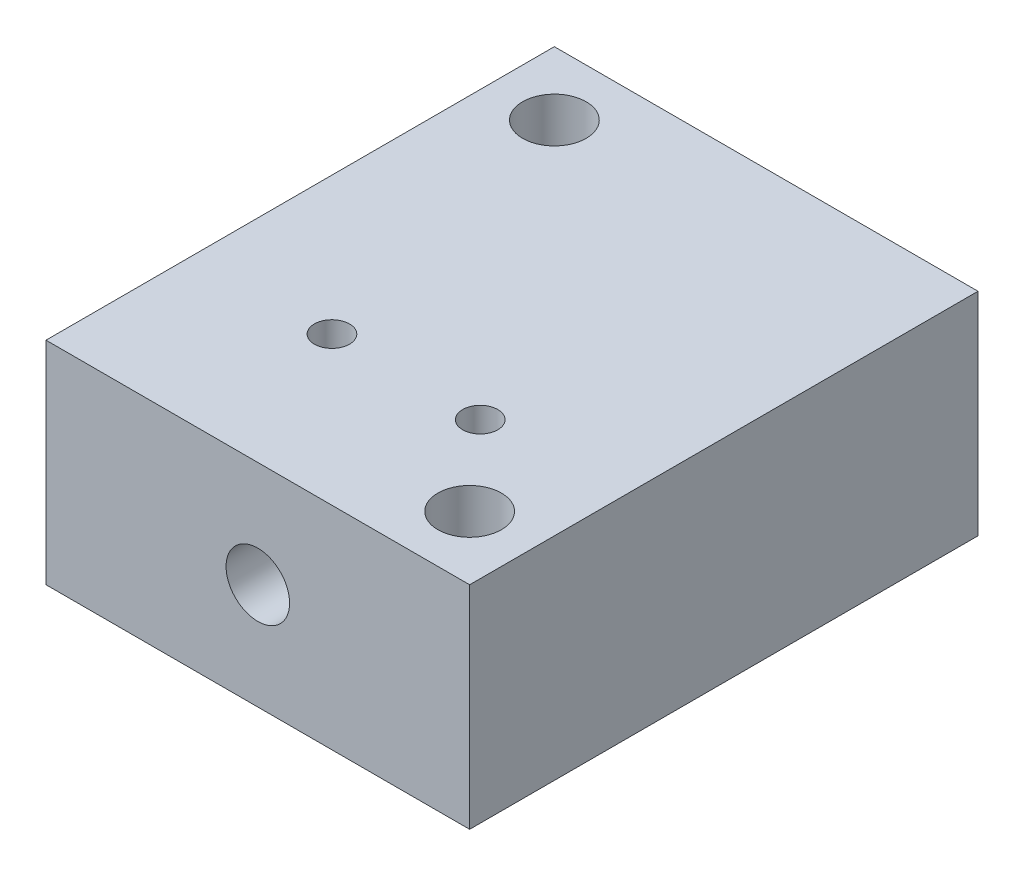
ISO-10303-21;
HEADER;
FILE_DESCRIPTION(('STEP AP214'),'2;1');
FILE_NAME('part.step','',(''),(''),'','','');
FILE_SCHEMA(('AUTOMOTIVE_DESIGN { 1 0 10303 214 1 1 1 1 }'));
ENDSEC;
DATA;
#1=APPLICATION_CONTEXT('core data for automotive mechanical design processes');
#2=APPLICATION_PROTOCOL_DEFINITION('international standard','automotive_design',2000,#1);
#3=PRODUCT_CONTEXT('',#1,'mechanical');
#4=PRODUCT('Part','Part','',(#3));
#5=PRODUCT_RELATED_PRODUCT_CATEGORY('part','',(#4));
#6=PRODUCT_DEFINITION_FORMATION('','',#4);
#7=PRODUCT_DEFINITION_CONTEXT('part definition',#1,'design');
#8=PRODUCT_DEFINITION('design','',#6,#7);
#9=PRODUCT_DEFINITION_SHAPE('','',#8);
#10=(LENGTH_UNIT() NAMED_UNIT(*) SI_UNIT(.MILLI.,.METRE.));
#11=(NAMED_UNIT(*) PLANE_ANGLE_UNIT() SI_UNIT($,.RADIAN.));
#12=(NAMED_UNIT(*) SI_UNIT($,.STERADIAN.) SOLID_ANGLE_UNIT());
#13=UNCERTAINTY_MEASURE_WITH_UNIT(LENGTH_MEASURE(1.E-05),#10,'distance_accuracy_value','');
#14=(GEOMETRIC_REPRESENTATION_CONTEXT(3) GLOBAL_UNCERTAINTY_ASSIGNED_CONTEXT((#13)) GLOBAL_UNIT_ASSIGNED_CONTEXT((#10,
#11,#12)) REPRESENTATION_CONTEXT('',''));
#15=CARTESIAN_POINT('',(0.,0.,0.));
#16=DIRECTION('',(0.,0.,1.));
#17=DIRECTION('',(1.,0.,0.));
#18=AXIS2_PLACEMENT_3D('',#15,#16,#17);
#19=CARTESIAN_POINT('',(-50.,-25.,120.));
#20=DIRECTION('',(1.,0.,0.));
#21=DIRECTION('',(0.,1.,0.));
#22=AXIS2_PLACEMENT_3D('',#19,#20,#21);
#23=PLANE('',#22);
#24=DIRECTION('',(0.,-1.,0.));
#25=VECTOR('',#24,1.);
#26=CARTESIAN_POINT('',(-50.,-25.,0.));
#27=LINE('',#26,#25);
#28=CARTESIAN_POINT('',(-50.,25.,0.));
#29=VERTEX_POINT('',#28);
#30=CARTESIAN_POINT('',(-50.,-25.,0.));
#31=VERTEX_POINT('',#30);
#32=EDGE_CURVE('E155',#29,#31,#27,.T.);
#33=ORIENTED_EDGE('',*,*,#32,.T.);
#34=DIRECTION('',(0.,0.,-1.));
#35=VECTOR('',#34,1.);
#36=CARTESIAN_POINT('',(-50.,-25.,120.));
#37=LINE('',#36,#35);
#38=CARTESIAN_POINT('',(-50.,-25.,120.));
#39=VERTEX_POINT('',#38);
#40=EDGE_CURVE('E13',#39,#31,#37,.T.);
#41=ORIENTED_EDGE('',*,*,#40,.F.);
#42=DIRECTION('',(0.,-1.,0.));
#43=VECTOR('',#42,1.);
#44=CARTESIAN_POINT('',(-50.,-25.,120.));
#45=LINE('',#44,#43);
#46=CARTESIAN_POINT('',(-50.,25.,120.));
#47=VERTEX_POINT('',#46);
#48=EDGE_CURVE('E156',#47,#39,#45,.T.);
#49=ORIENTED_EDGE('',*,*,#48,.F.);
#50=DIRECTION('',(0.,0.,-1.));
#51=VECTOR('',#50,1.);
#52=CARTESIAN_POINT('',(-50.,25.,120.));
#53=LINE('',#52,#51);
#54=EDGE_CURVE('E162',#47,#29,#53,.T.);
#55=ORIENTED_EDGE('',*,*,#54,.T.);
#56=EDGE_LOOP('',(#33,#41,#49,#55));
#57=FACE_BOUND('',#56,.T.);
#58=ADVANCED_FACE('F44',(#57),#23,.F.);
#59=CARTESIAN_POINT('',(50.,-25.,120.));
#60=DIRECTION('',(0.,1.,0.));
#61=DIRECTION('',(-1.,0.,0.));
#62=AXIS2_PLACEMENT_3D('',#59,#60,#61);
#63=PLANE('',#62);
#64=CARTESIAN_POINT('',(35.,-25.,105.));
#65=DIRECTION('',(0.,1.,0.));
#66=DIRECTION('',(0.,0.,1.));
#67=AXIS2_PLACEMENT_3D('',#64,#65,#66);
#68=CIRCLE('',#67,4.49999999999999);
#69=CARTESIAN_POINT('',(35.,-25.,109.5));
#70=VERTEX_POINT('',#69);
#71=EDGE_CURVE('E140',#70,#70,#68,.T.);
#72=ORIENTED_EDGE('',*,*,#71,.T.);
#73=EDGE_LOOP('',(#72));
#74=FACE_BOUND('',#73,.T.);
#75=CARTESIAN_POINT('',(-35.,-25.,15.));
#76=DIRECTION('',(0.,1.,0.));
#77=DIRECTION('',(0.,0.,1.));
#78=AXIS2_PLACEMENT_3D('',#75,#76,#77);
#79=CIRCLE('',#78,4.49999999999999);
#80=CARTESIAN_POINT('',(-35.,-25.,19.5));
#81=VERTEX_POINT('',#80);
#82=EDGE_CURVE('E152',#81,#81,#79,.T.);
#83=ORIENTED_EDGE('',*,*,#82,.T.);
#84=EDGE_LOOP('',(#83));
#85=FACE_BOUND('',#84,.T.);
#86=DIRECTION('',(1.,0.,0.));
#87=VECTOR('',#86,1.);
#88=CARTESIAN_POINT('',(50.,-25.,0.));
#89=LINE('',#88,#87);
#90=CARTESIAN_POINT('',(50.,-25.,0.));
#91=VERTEX_POINT('',#90);
#92=EDGE_CURVE('E165',#31,#91,#89,.T.);
#93=ORIENTED_EDGE('',*,*,#92,.T.);
#94=DIRECTION('',(0.,0.,-1.));
#95=VECTOR('',#94,1.);
#96=CARTESIAN_POINT('',(50.,-25.,120.));
#97=LINE('',#96,#95);
#98=CARTESIAN_POINT('',(50.,-25.,120.));
#99=VERTEX_POINT('',#98);
#100=EDGE_CURVE('E52',#99,#91,#97,.T.);
#101=ORIENTED_EDGE('',*,*,#100,.F.);
#102=DIRECTION('',(1.,0.,0.));
#103=VECTOR('',#102,1.);
#104=CARTESIAN_POINT('',(50.,-25.,120.));
#105=LINE('',#104,#103);
#106=EDGE_CURVE('E91',#39,#99,#105,.T.);
#107=ORIENTED_EDGE('',*,*,#106,.F.);
#108=ORIENTED_EDGE('',*,*,#40,.T.);
#109=EDGE_LOOP('',(#93,#101,#107,#108));
#110=FACE_BOUND('',#109,.T.);
#111=ADVANCED_FACE('F192',(#74,#85,#110),#63,.F.);
#112=CARTESIAN_POINT('',(50.,-25.,120.));
#113=DIRECTION('',(-1.,0.,0.));
#114=DIRECTION('',(0.,-1.,0.));
#115=AXIS2_PLACEMENT_3D('',#112,#113,#114);
#116=PLANE('',#115);
#117=DIRECTION('',(0.,1.,0.));
#118=VECTOR('',#117,1.);
#119=CARTESIAN_POINT('',(50.,-25.,0.));
#120=LINE('',#119,#118);
#121=CARTESIAN_POINT('',(50.,25.,0.));
#122=VERTEX_POINT('',#121);
#123=EDGE_CURVE('E78',#91,#122,#120,.T.);
#124=ORIENTED_EDGE('',*,*,#123,.T.);
#125=DIRECTION('',(0.,0.,-1.));
#126=VECTOR('',#125,1.);
#127=CARTESIAN_POINT('',(50.,25.,120.));
#128=LINE('',#127,#126);
#129=CARTESIAN_POINT('',(50.,25.,120.));
#130=VERTEX_POINT('',#129);
#131=EDGE_CURVE('E170',#130,#122,#128,.T.);
#132=ORIENTED_EDGE('',*,*,#131,.F.);
#133=DIRECTION('',(0.,1.,0.));
#134=VECTOR('',#133,1.);
#135=CARTESIAN_POINT('',(50.,-25.,120.));
#136=LINE('',#135,#134);
#137=EDGE_CURVE('E159',#99,#130,#136,.T.);
#138=ORIENTED_EDGE('',*,*,#137,.F.);
#139=ORIENTED_EDGE('',*,*,#100,.T.);
#140=EDGE_LOOP('',(#124,#132,#138,#139));
#141=FACE_BOUND('',#140,.T.);
#142=ADVANCED_FACE('F172',(#141),#116,.F.);
#143=CARTESIAN_POINT('',(50.,25.,120.));
#144=DIRECTION('',(0.,-1.,0.));
#145=DIRECTION('',(1.,0.,0.));
#146=AXIS2_PLACEMENT_3D('',#143,#144,#145);
#147=PLANE('',#146);
#148=CARTESIAN_POINT('',(-17.5,25.,85.));
#149=DIRECTION('',(0.,1.,0.));
#150=DIRECTION('',(0.,0.,1.));
#151=AXIS2_PLACEMENT_3D('',#148,#149,#150);
#152=CIRCLE('',#151,4.14999999999999);
#153=CARTESIAN_POINT('',(-17.5,25.,89.15));
#154=VERTEX_POINT('',#153);
#155=EDGE_CURVE('E109',#154,#154,#152,.T.);
#156=ORIENTED_EDGE('',*,*,#155,.F.);
#157=EDGE_LOOP('',(#156));
#158=FACE_BOUND('',#157,.T.);
#159=CARTESIAN_POINT('',(17.5,25.,85.));
#160=DIRECTION('',(0.,1.,0.));
#161=DIRECTION('',(0.,0.,1.));
#162=AXIS2_PLACEMENT_3D('',#159,#160,#161);
#163=CIRCLE('',#162,4.14999999999999);
#164=CARTESIAN_POINT('',(17.5,25.,89.15));
#165=VERTEX_POINT('',#164);
#166=EDGE_CURVE('E108',#165,#165,#163,.T.);
#167=ORIENTED_EDGE('',*,*,#166,.F.);
#168=EDGE_LOOP('',(#167));
#169=FACE_BOUND('',#168,.T.);
#170=CARTESIAN_POINT('',(35.,25.,105.));
#171=DIRECTION('',(0.,1.,0.));
#172=DIRECTION('',(0.,0.,1.));
#173=AXIS2_PLACEMENT_3D('',#170,#171,#172);
#174=CIRCLE('',#173,7.49999999999999);
#175=CARTESIAN_POINT('',(35.,25.,112.5));
#176=VERTEX_POINT('',#175);
#177=EDGE_CURVE('E131',#176,#176,#174,.T.);
#178=ORIENTED_EDGE('',*,*,#177,.F.);
#179=EDGE_LOOP('',(#178));
#180=FACE_BOUND('',#179,.T.);
#181=CARTESIAN_POINT('',(-35.,25.,15.));
#182=DIRECTION('',(0.,1.,0.));
#183=DIRECTION('',(0.,0.,1.));
#184=AXIS2_PLACEMENT_3D('',#181,#182,#183);
#185=CIRCLE('',#184,7.5);
#186=CARTESIAN_POINT('',(-35.,25.,22.5));
#187=VERTEX_POINT('',#186);
#188=EDGE_CURVE('E143',#187,#187,#185,.T.);
#189=ORIENTED_EDGE('',*,*,#188,.F.);
#190=EDGE_LOOP('',(#189));
#191=FACE_BOUND('',#190,.T.);
#192=DIRECTION('',(-1.,0.,0.));
#193=VECTOR('',#192,1.);
#194=CARTESIAN_POINT('',(50.,25.,0.));
#195=LINE('',#194,#193);
#196=EDGE_CURVE('E84',#122,#29,#195,.T.);
#197=ORIENTED_EDGE('',*,*,#196,.T.);
#198=ORIENTED_EDGE('',*,*,#54,.F.);
#199=DIRECTION('',(-1.,0.,0.));
#200=VECTOR('',#199,1.);
#201=CARTESIAN_POINT('',(50.,25.,120.));
#202=LINE('',#201,#200);
#203=EDGE_CURVE('E60',#130,#47,#202,.T.);
#204=ORIENTED_EDGE('',*,*,#203,.F.);
#205=ORIENTED_EDGE('',*,*,#131,.T.);
#206=EDGE_LOOP('',(#197,#198,#204,#205));
#207=FACE_BOUND('',#206,.T.);
#208=ADVANCED_FACE('F179',(#158,#169,#180,#191,#207),#147,.F.);
#209=CARTESIAN_POINT('',(0.,0.,120.));
#210=DIRECTION('',(0.,0.,1.));
#211=DIRECTION('',(1.,0.,0.));
#212=AXIS2_PLACEMENT_3D('',#209,#210,#211);
#213=PLANE('',#212);
#214=CARTESIAN_POINT('',(0.,0.,120.));
#215=DIRECTION('',(0.,0.,1.));
#216=DIRECTION('',(1.,0.,0.));
#217=AXIS2_PLACEMENT_3D('',#214,#215,#216);
#218=CIRCLE('',#217,7.5);
#219=CARTESIAN_POINT('',(7.5,0.,120.));
#220=VERTEX_POINT('',#219);
#221=EDGE_CURVE('E119',#220,#220,#218,.T.);
#222=ORIENTED_EDGE('',*,*,#221,.F.);
#223=EDGE_LOOP('',(#222));
#224=FACE_BOUND('',#223,.T.);
#225=ORIENTED_EDGE('',*,*,#48,.T.);
#226=ORIENTED_EDGE('',*,*,#106,.T.);
#227=ORIENTED_EDGE('',*,*,#137,.T.);
#228=ORIENTED_EDGE('',*,*,#203,.T.);
#229=EDGE_LOOP('',(#225,#226,#227,#228));
#230=FACE_BOUND('',#229,.T.);
#231=ADVANCED_FACE('F181',(#224,#230),#213,.T.);
#232=CARTESIAN_POINT('',(0.,0.,0.));
#233=DIRECTION('',(0.,0.,1.));
#234=DIRECTION('',(1.,0.,0.));
#235=AXIS2_PLACEMENT_3D('',#232,#233,#234);
#236=PLANE('',#235);
#237=CARTESIAN_POINT('',(0.,0.,0.));
#238=DIRECTION('',(0.,0.,1.));
#239=DIRECTION('',(1.,0.,0.));
#240=AXIS2_PLACEMENT_3D('',#237,#238,#239);
#241=CIRCLE('',#240,4.49999999999997);
#242=CARTESIAN_POINT('',(4.49999999999997,0.,0.));
#243=VERTEX_POINT('',#242);
#244=EDGE_CURVE('E128',#243,#243,#241,.T.);
#245=ORIENTED_EDGE('',*,*,#244,.T.);
#246=EDGE_LOOP('',(#245));
#247=FACE_BOUND('',#246,.T.);
#248=ORIENTED_EDGE('',*,*,#32,.F.);
#249=ORIENTED_EDGE('',*,*,#196,.F.);
#250=ORIENTED_EDGE('',*,*,#123,.F.);
#251=ORIENTED_EDGE('',*,*,#92,.F.);
#252=EDGE_LOOP('',(#248,#249,#250,#251));
#253=FACE_BOUND('',#252,.T.);
#254=ADVANCED_FACE('F175',(#247,#253),#236,.F.);
#255=CARTESIAN_POINT('',(-35.,25.,15.));
#256=DIRECTION('',(0.,1.,0.));
#257=DIRECTION('',(0.,0.,1.));
#258=AXIS2_PLACEMENT_3D('',#255,#256,#257);
#259=CYLINDRICAL_SURFACE('',#258,4.49999999999999);
#260=ORIENTED_EDGE('',*,*,#82,.F.);
#261=EDGE_LOOP('',(#260));
#262=FACE_BOUND('',#261,.T.);
#263=CARTESIAN_POINT('',(-35.,-20.,15.));
#264=DIRECTION('',(0.,1.,0.));
#265=DIRECTION('',(0.,0.,1.));
#266=AXIS2_PLACEMENT_3D('',#263,#264,#265);
#267=CIRCLE('',#266,4.49999999999999);
#268=CARTESIAN_POINT('',(-35.,-20.,19.5));
#269=VERTEX_POINT('',#268);
#270=EDGE_CURVE('E149',#269,#269,#267,.T.);
#271=ORIENTED_EDGE('',*,*,#270,.T.);
#272=EDGE_LOOP('',(#271));
#273=FACE_BOUND('',#272,.T.);
#274=ADVANCED_FACE('F208',(#262,#273),#259,.F.);
#275=CARTESIAN_POINT('',(-30.5,-20.,15.));
#276=DIRECTION('',(0.,-1.,0.));
#277=DIRECTION('',(0.,0.,-1.));
#278=AXIS2_PLACEMENT_3D('',#275,#276,#277);
#279=PLANE('',#278);
#280=ORIENTED_EDGE('',*,*,#270,.F.);
#281=EDGE_LOOP('',(#280));
#282=FACE_BOUND('',#281,.T.);
#283=CARTESIAN_POINT('',(-35.,-20.,15.));
#284=DIRECTION('',(0.,1.,0.));
#285=DIRECTION('',(0.,0.,1.));
#286=AXIS2_PLACEMENT_3D('',#283,#284,#285);
#287=CIRCLE('',#286,7.49999999999999);
#288=CARTESIAN_POINT('',(-35.,-20.,22.5));
#289=VERTEX_POINT('',#288);
#290=EDGE_CURVE('E146',#289,#289,#287,.T.);
#291=ORIENTED_EDGE('',*,*,#290,.T.);
#292=EDGE_LOOP('',(#291));
#293=FACE_BOUND('',#292,.T.);
#294=ADVANCED_FACE('F211',(#282,#293),#279,.F.);
#295=CARTESIAN_POINT('',(-35.,25.,15.));
#296=DIRECTION('',(0.,1.,0.));
#297=DIRECTION('',(0.,0.,1.));
#298=AXIS2_PLACEMENT_3D('',#295,#296,#297);
#299=CYLINDRICAL_SURFACE('',#298,7.49999999999999);
#300=ORIENTED_EDGE('',*,*,#290,.F.);
#301=EDGE_LOOP('',(#300));
#302=FACE_BOUND('',#301,.T.);
#303=ORIENTED_EDGE('',*,*,#188,.T.);
#304=EDGE_LOOP('',(#303));
#305=FACE_BOUND('',#304,.T.);
#306=ADVANCED_FACE('F217',(#302,#305),#299,.F.);
#307=CARTESIAN_POINT('',(35.,25.,105.));
#308=DIRECTION('',(0.,1.,0.));
#309=DIRECTION('',(0.,0.,1.));
#310=AXIS2_PLACEMENT_3D('',#307,#308,#309);
#311=CYLINDRICAL_SURFACE('',#310,4.49999999999999);
#312=ORIENTED_EDGE('',*,*,#71,.F.);
#313=EDGE_LOOP('',(#312));
#314=FACE_BOUND('',#313,.T.);
#315=CARTESIAN_POINT('',(35.,-20.,105.));
#316=DIRECTION('',(0.,1.,0.));
#317=DIRECTION('',(0.,0.,1.));
#318=AXIS2_PLACEMENT_3D('',#315,#316,#317);
#319=CIRCLE('',#318,4.49999999999999);
#320=CARTESIAN_POINT('',(35.,-20.,109.5));
#321=VERTEX_POINT('',#320);
#322=EDGE_CURVE('E137',#321,#321,#319,.T.);
#323=ORIENTED_EDGE('',*,*,#322,.T.);
#324=EDGE_LOOP('',(#323));
#325=FACE_BOUND('',#324,.T.);
#326=ADVANCED_FACE('F223',(#314,#325),#311,.F.);
#327=CARTESIAN_POINT('',(39.5,-20.,105.));
#328=DIRECTION('',(0.,-1.,0.));
#329=DIRECTION('',(0.,0.,-1.));
#330=AXIS2_PLACEMENT_3D('',#327,#328,#329);
#331=PLANE('',#330);
#332=ORIENTED_EDGE('',*,*,#322,.F.);
#333=EDGE_LOOP('',(#332));
#334=FACE_BOUND('',#333,.T.);
#335=CARTESIAN_POINT('',(35.,-20.,105.));
#336=DIRECTION('',(0.,1.,0.));
#337=DIRECTION('',(0.,0.,1.));
#338=AXIS2_PLACEMENT_3D('',#335,#336,#337);
#339=CIRCLE('',#338,7.49999999999999);
#340=CARTESIAN_POINT('',(35.,-20.,112.5));
#341=VERTEX_POINT('',#340);
#342=EDGE_CURVE('E134',#341,#341,#339,.T.);
#343=ORIENTED_EDGE('',*,*,#342,.T.);
#344=EDGE_LOOP('',(#343));
#345=FACE_BOUND('',#344,.T.);
#346=ADVANCED_FACE('F230',(#334,#345),#331,.F.);
#347=CARTESIAN_POINT('',(35.,25.,105.));
#348=DIRECTION('',(0.,1.,0.));
#349=DIRECTION('',(0.,0.,1.));
#350=AXIS2_PLACEMENT_3D('',#347,#348,#349);
#351=CYLINDRICAL_SURFACE('',#350,7.49999999999999);
#352=ORIENTED_EDGE('',*,*,#342,.F.);
#353=EDGE_LOOP('',(#352));
#354=FACE_BOUND('',#353,.T.);
#355=ORIENTED_EDGE('',*,*,#177,.T.);
#356=EDGE_LOOP('',(#355));
#357=FACE_BOUND('',#356,.T.);
#358=ADVANCED_FACE('F244',(#354,#357),#351,.F.);
#359=CARTESIAN_POINT('',(0.,0.,120.));
#360=DIRECTION('',(0.,0.,1.));
#361=DIRECTION('',(1.,0.,0.));
#362=AXIS2_PLACEMENT_3D('',#359,#360,#361);
#363=CYLINDRICAL_SURFACE('',#362,4.49999999999997);
#364=ORIENTED_EDGE('',*,*,#244,.F.);
#365=EDGE_LOOP('',(#364));
#366=FACE_BOUND('',#365,.T.);
#367=CARTESIAN_POINT('',(0.,0.,4.));
#368=DIRECTION('',(0.,0.,1.));
#369=DIRECTION('',(1.,0.,0.));
#370=AXIS2_PLACEMENT_3D('',#367,#368,#369);
#371=CIRCLE('',#370,4.49999999999997);
#372=CARTESIAN_POINT('',(4.49999999999997,0.,4.));
#373=VERTEX_POINT('',#372);
#374=EDGE_CURVE('E125',#373,#373,#371,.T.);
#375=ORIENTED_EDGE('',*,*,#374,.T.);
#376=EDGE_LOOP('',(#375));
#377=FACE_BOUND('',#376,.T.);
#378=ADVANCED_FACE('F240',(#366,#377),#363,.F.);
#379=CARTESIAN_POINT('',(4.49999999999997,0.,4.));
#380=DIRECTION('',(0.,0.,-1.));
#381=DIRECTION('',(-1.,0.,0.));
#382=AXIS2_PLACEMENT_3D('',#379,#380,#381);
#383=PLANE('',#382);
#384=ORIENTED_EDGE('',*,*,#374,.F.);
#385=EDGE_LOOP('',(#384));
#386=FACE_BOUND('',#385,.T.);
#387=CARTESIAN_POINT('',(0.,0.,3.99999999999999));
#388=DIRECTION('',(0.,0.,1.));
#389=DIRECTION('',(1.,0.,0.));
#390=AXIS2_PLACEMENT_3D('',#387,#388,#389);
#391=CIRCLE('',#390,7.49999999999999);
#392=CARTESIAN_POINT('',(7.49999999999999,0.,3.99999999999999));
#393=VERTEX_POINT('',#392);
#394=EDGE_CURVE('E122',#393,#393,#391,.T.);
#395=ORIENTED_EDGE('',*,*,#394,.T.);
#396=EDGE_LOOP('',(#395));
#397=FACE_BOUND('',#396,.T.);
#398=ADVANCED_FACE('F243',(#386,#397),#383,.F.);
#399=CARTESIAN_POINT('',(0.,0.,120.));
#400=DIRECTION('',(0.,0.,1.));
#401=DIRECTION('',(1.,0.,0.));
#402=AXIS2_PLACEMENT_3D('',#399,#400,#401);
#403=CYLINDRICAL_SURFACE('',#402,7.49999999999999);
#404=ORIENTED_EDGE('',*,*,#394,.F.);
#405=EDGE_LOOP('',(#404));
#406=FACE_BOUND('',#405,.T.);
#407=ORIENTED_EDGE('',*,*,#221,.T.);
#408=EDGE_LOOP('',(#407));
#409=FACE_BOUND('',#408,.T.);
#410=ADVANCED_FACE('F250',(#406,#409),#403,.F.);
#411=CARTESIAN_POINT('',(17.5,5.,85.));
#412=DIRECTION('',(0.,1.,0.));
#413=DIRECTION('',(0.,0.,1.));
#414=AXIS2_PLACEMENT_3D('',#411,#412,#413);
#415=CONICAL_SURFACE('',#414,4.14999999999999,1.02974425867665);
#416=CARTESIAN_POINT('',(17.5,2.50642843103562,85.));
#417=VERTEX_POINT('',#416);
#418=VERTEX_LOOP('',#417);
#419=FACE_BOUND('',#418,.T.);
#420=CARTESIAN_POINT('',(17.5,5.,85.));
#421=DIRECTION('',(0.,1.,0.));
#422=DIRECTION('',(0.,0.,1.));
#423=AXIS2_PLACEMENT_3D('',#420,#421,#422);
#424=CIRCLE('',#423,4.14999999999999);
#425=CARTESIAN_POINT('',(17.5,5.,89.15));
#426=VERTEX_POINT('',#425);
#427=EDGE_CURVE('E112',#426,#426,#424,.T.);
#428=ORIENTED_EDGE('',*,*,#427,.T.);
#429=EDGE_LOOP('',(#428));
#430=FACE_BOUND('',#429,.T.);
#431=ADVANCED_FACE('F256',(#419,#430),#415,.F.);
#432=CARTESIAN_POINT('',(17.5,25.,85.));
#433=DIRECTION('',(0.,1.,0.));
#434=DIRECTION('',(0.,0.,1.));
#435=AXIS2_PLACEMENT_3D('',#432,#433,#434);
#436=CYLINDRICAL_SURFACE('',#435,4.14999999999999);
#437=ORIENTED_EDGE('',*,*,#427,.F.);
#438=EDGE_LOOP('',(#437));
#439=FACE_BOUND('',#438,.T.);
#440=ORIENTED_EDGE('',*,*,#166,.T.);
#441=EDGE_LOOP('',(#440));
#442=FACE_BOUND('',#441,.T.);
#443=ADVANCED_FACE('F102',(#439,#442),#436,.F.);
#444=CARTESIAN_POINT('',(-17.5,5.,85.));
#445=DIRECTION('',(0.,1.,0.));
#446=DIRECTION('',(0.,0.,1.));
#447=AXIS2_PLACEMENT_3D('',#444,#445,#446);
#448=CONICAL_SURFACE('',#447,4.14999999999999,1.02974425867665);
#449=CARTESIAN_POINT('',(-17.5,2.50642843103562,85.));
#450=VERTEX_POINT('',#449);
#451=VERTEX_LOOP('',#450);
#452=FACE_BOUND('',#451,.T.);
#453=CARTESIAN_POINT('',(-17.5,5.,85.));
#454=DIRECTION('',(0.,1.,0.));
#455=DIRECTION('',(0.,0.,1.));
#456=AXIS2_PLACEMENT_3D('',#453,#454,#455);
#457=CIRCLE('',#456,4.14999999999999);
#458=CARTESIAN_POINT('',(-17.5,5.,89.15));
#459=VERTEX_POINT('',#458);
#460=EDGE_CURVE('E106',#459,#459,#457,.T.);
#461=ORIENTED_EDGE('',*,*,#460,.T.);
#462=EDGE_LOOP('',(#461));
#463=FACE_BOUND('',#462,.T.);
#464=ADVANCED_FACE('F98',(#452,#463),#448,.F.);
#465=CARTESIAN_POINT('',(-17.5,25.,85.));
#466=DIRECTION('',(0.,1.,0.));
#467=DIRECTION('',(0.,0.,1.));
#468=AXIS2_PLACEMENT_3D('',#465,#466,#467);
#469=CYLINDRICAL_SURFACE('',#468,4.14999999999999);
#470=ORIENTED_EDGE('',*,*,#460,.F.);
#471=EDGE_LOOP('',(#470));
#472=FACE_BOUND('',#471,.T.);
#473=ORIENTED_EDGE('',*,*,#155,.T.);
#474=EDGE_LOOP('',(#473));
#475=FACE_BOUND('',#474,.T.);
#476=ADVANCED_FACE('F101',(#472,#475),#469,.F.);
#477=CLOSED_SHELL('',(#58,#111,#142,#208,#231,#254,#274,#294,#306,#326,#346,#358,#378,#398,#410,
#431,#443,#464,#476));
#478=MANIFOLD_SOLID_BREP('B2',#477);
#479=ADVANCED_BREP_SHAPE_REPRESENTATION('',(#18,#478),#14);
#480=SHAPE_DEFINITION_REPRESENTATION(#9,#479);
ENDSEC;
END-ISO-10303-21;
